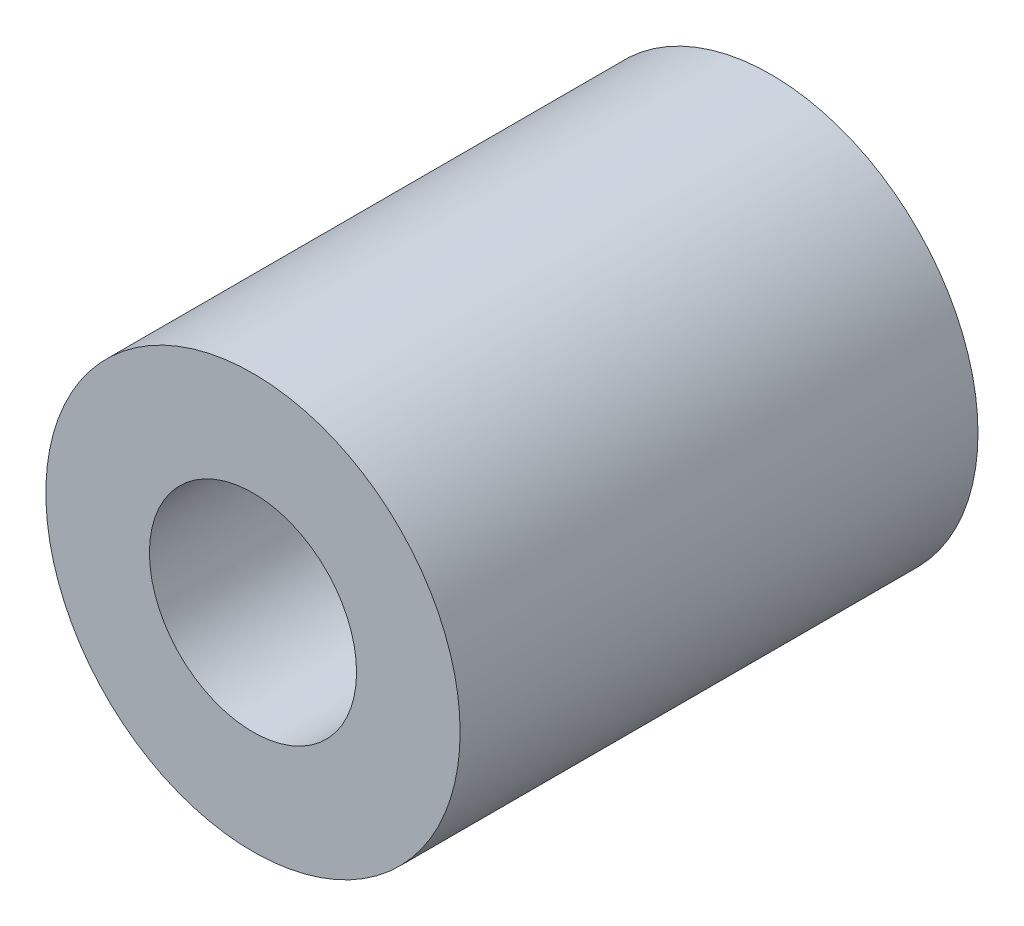
ISO-10303-21;
HEADER;
FILE_DESCRIPTION(('STEP AP214'),'2;1');
FILE_NAME('part.step','',(''),(''),'','','');
FILE_SCHEMA(('AUTOMOTIVE_DESIGN { 1 0 10303 214 1 1 1 1 }'));
ENDSEC;
DATA;
#1=APPLICATION_CONTEXT('core data for automotive mechanical design processes');
#2=APPLICATION_PROTOCOL_DEFINITION('international standard','automotive_design',2000,#1);
#3=PRODUCT_CONTEXT('',#1,'mechanical');
#4=PRODUCT('Part','Part','',(#3));
#5=PRODUCT_RELATED_PRODUCT_CATEGORY('part','',(#4));
#6=PRODUCT_DEFINITION_FORMATION('','',#4);
#7=PRODUCT_DEFINITION_CONTEXT('part definition',#1,'design');
#8=PRODUCT_DEFINITION('design','',#6,#7);
#9=PRODUCT_DEFINITION_SHAPE('','',#8);
#10=(LENGTH_UNIT() NAMED_UNIT(*) SI_UNIT(.MILLI.,.METRE.));
#11=(NAMED_UNIT(*) PLANE_ANGLE_UNIT() SI_UNIT($,.RADIAN.));
#12=(NAMED_UNIT(*) SI_UNIT($,.STERADIAN.) SOLID_ANGLE_UNIT());
#13=UNCERTAINTY_MEASURE_WITH_UNIT(LENGTH_MEASURE(1.E-05),#10,'distance_accuracy_value','');
#14=(GEOMETRIC_REPRESENTATION_CONTEXT(3) GLOBAL_UNCERTAINTY_ASSIGNED_CONTEXT((#13)) GLOBAL_UNIT_ASSIGNED_CONTEXT((#10,
#11,#12)) REPRESENTATION_CONTEXT('',''));
#15=CARTESIAN_POINT('',(0.,0.,0.));
#16=DIRECTION('',(0.,0.,1.));
#17=DIRECTION('',(1.,0.,0.));
#18=AXIS2_PLACEMENT_3D('',#15,#16,#17);
#19=CARTESIAN_POINT('',(0.,0.,5.));
#20=DIRECTION('',(0.,0.,1.));
#21=DIRECTION('',(1.,0.,0.));
#22=AXIS2_PLACEMENT_3D('',#19,#20,#21);
#23=PLANE('',#22);
#24=CARTESIAN_POINT('',(0.,0.,5.));
#25=DIRECTION('',(0.,0.,1.));
#26=DIRECTION('',(1.,0.,0.));
#27=AXIS2_PLACEMENT_3D('',#24,#25,#26);
#28=CIRCLE('',#27,2.);
#29=CARTESIAN_POINT('',(2.,0.,5.));
#30=VERTEX_POINT('',#29);
#31=EDGE_CURVE('E10',#30,#30,#28,.T.);
#32=ORIENTED_EDGE('',*,*,#31,.T.);
#33=EDGE_LOOP('',(#32));
#34=FACE_BOUND('',#33,.T.);
#35=CARTESIAN_POINT('',(0.,0.,5.));
#36=DIRECTION('',(0.,0.,1.));
#37=DIRECTION('',(1.,0.,0.));
#38=AXIS2_PLACEMENT_3D('',#35,#36,#37);
#39=CIRCLE('',#38,1.);
#40=CARTESIAN_POINT('',(1.,0.,5.));
#41=VERTEX_POINT('',#40);
#42=EDGE_CURVE('E48',#41,#41,#39,.T.);
#43=ORIENTED_EDGE('',*,*,#42,.F.);
#44=EDGE_LOOP('',(#43));
#45=FACE_BOUND('',#44,.T.);
#46=ADVANCED_FACE('F37',(#34,#45),#23,.T.);
#47=CARTESIAN_POINT('',(0.,0.,0.));
#48=DIRECTION('',(0.,0.,1.));
#49=DIRECTION('',(1.,0.,0.));
#50=AXIS2_PLACEMENT_3D('',#47,#48,#49);
#51=PLANE('',#50);
#52=CARTESIAN_POINT('',(0.,0.,0.));
#53=DIRECTION('',(0.,0.,1.));
#54=DIRECTION('',(1.,0.,0.));
#55=AXIS2_PLACEMENT_3D('',#52,#53,#54);
#56=CIRCLE('',#55,2.);
#57=CARTESIAN_POINT('',(2.,0.,0.));
#58=VERTEX_POINT('',#57);
#59=EDGE_CURVE('E41',#58,#58,#56,.T.);
#60=ORIENTED_EDGE('',*,*,#59,.F.);
#61=EDGE_LOOP('',(#60));
#62=FACE_BOUND('',#61,.T.);
#63=CARTESIAN_POINT('',(0.,0.,0.));
#64=DIRECTION('',(0.,0.,1.));
#65=DIRECTION('',(1.,0.,0.));
#66=AXIS2_PLACEMENT_3D('',#63,#64,#65);
#67=CIRCLE('',#66,1.);
#68=CARTESIAN_POINT('',(1.,0.,0.));
#69=VERTEX_POINT('',#68);
#70=EDGE_CURVE('E50',#69,#69,#67,.T.);
#71=ORIENTED_EDGE('',*,*,#70,.T.);
#72=EDGE_LOOP('',(#71));
#73=FACE_BOUND('',#72,.T.);
#74=ADVANCED_FACE('F60',(#62,#73),#51,.F.);
#75=CARTESIAN_POINT('',(0.,0.,5.));
#76=DIRECTION('',(0.,0.,-1.));
#77=DIRECTION('',(-1.,0.,0.));
#78=AXIS2_PLACEMENT_3D('',#75,#76,#77);
#79=CYLINDRICAL_SURFACE('',#78,2.);
#80=ORIENTED_EDGE('',*,*,#31,.F.);
#81=EDGE_LOOP('',(#80));
#82=FACE_BOUND('',#81,.T.);
#83=ORIENTED_EDGE('',*,*,#59,.T.);
#84=EDGE_LOOP('',(#83));
#85=FACE_BOUND('',#84,.T.);
#86=ADVANCED_FACE('F39',(#82,#85),#79,.T.);
#87=CARTESIAN_POINT('',(0.,0.,5.));
#88=DIRECTION('',(0.,0.,-1.));
#89=DIRECTION('',(-1.,0.,0.));
#90=AXIS2_PLACEMENT_3D('',#87,#88,#89);
#91=CYLINDRICAL_SURFACE('',#90,1.);
#92=ORIENTED_EDGE('',*,*,#42,.T.);
#93=EDGE_LOOP('',(#92));
#94=FACE_BOUND('',#93,.T.);
#95=ORIENTED_EDGE('',*,*,#70,.F.);
#96=EDGE_LOOP('',(#95));
#97=FACE_BOUND('',#96,.T.);
#98=ADVANCED_FACE('F56',(#94,#97),#91,.F.);
#99=CLOSED_SHELL('',(#46,#74,#86,#98));
#100=MANIFOLD_SOLID_BREP('B2',#99);
#101=ADVANCED_BREP_SHAPE_REPRESENTATION('',(#18,#100),#14);
#102=SHAPE_DEFINITION_REPRESENTATION(#9,#101);
ENDSEC;
END-ISO-10303-21;
